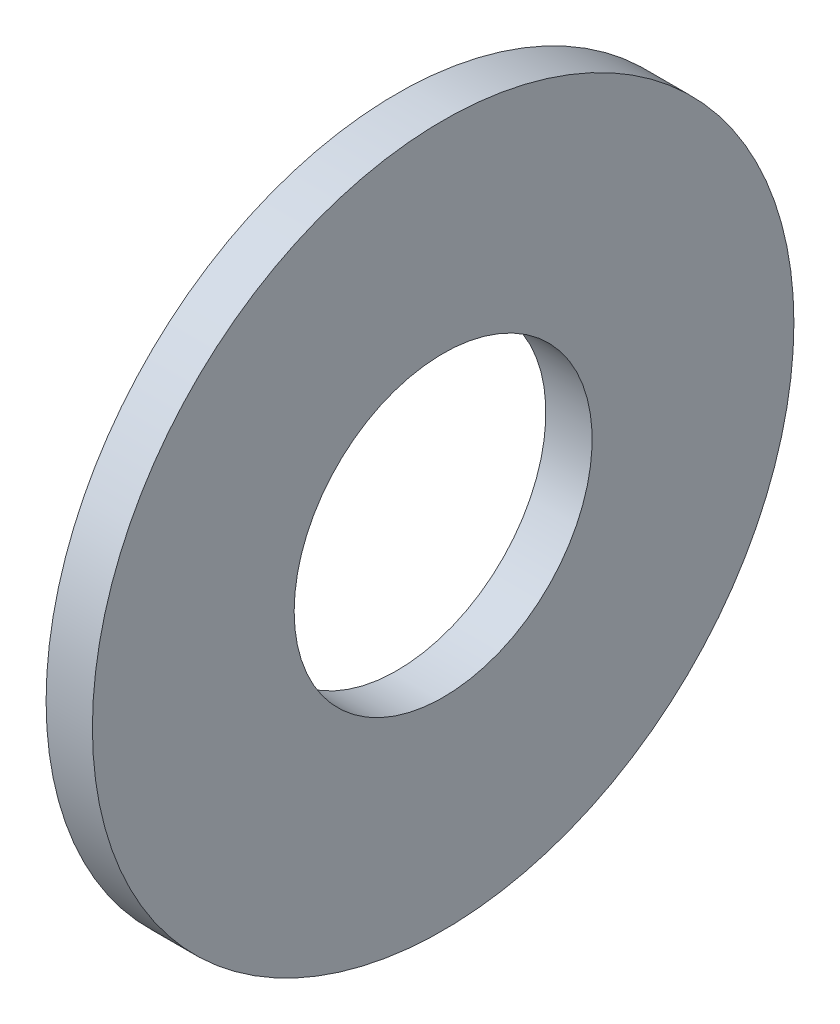
ISO-10303-21;
HEADER;
FILE_DESCRIPTION(('STEP AP214'),'2;1');
FILE_NAME('part.step','',(''),(''),'','','');
FILE_SCHEMA(('AUTOMOTIVE_DESIGN { 1 0 10303 214 1 1 1 1 }'));
ENDSEC;
DATA;
#1=APPLICATION_CONTEXT('core data for automotive mechanical design processes');
#2=APPLICATION_PROTOCOL_DEFINITION('international standard','automotive_design',2000,#1);
#3=PRODUCT_CONTEXT('',#1,'mechanical');
#4=PRODUCT('Part','Part','',(#3));
#5=PRODUCT_RELATED_PRODUCT_CATEGORY('part','',(#4));
#6=PRODUCT_DEFINITION_FORMATION('','',#4);
#7=PRODUCT_DEFINITION_CONTEXT('part definition',#1,'design');
#8=PRODUCT_DEFINITION('design','',#6,#7);
#9=PRODUCT_DEFINITION_SHAPE('','',#8);
#10=(LENGTH_UNIT() NAMED_UNIT(*) SI_UNIT(.MILLI.,.METRE.));
#11=(NAMED_UNIT(*) PLANE_ANGLE_UNIT() SI_UNIT($,.RADIAN.));
#12=(NAMED_UNIT(*) SI_UNIT($,.STERADIAN.) SOLID_ANGLE_UNIT());
#13=UNCERTAINTY_MEASURE_WITH_UNIT(LENGTH_MEASURE(1.E-05),#10,'distance_accuracy_value','');
#14=(GEOMETRIC_REPRESENTATION_CONTEXT(3) GLOBAL_UNCERTAINTY_ASSIGNED_CONTEXT((#13)) GLOBAL_UNIT_ASSIGNED_CONTEXT((#10,
#11,#12)) REPRESENTATION_CONTEXT('',''));
#15=CARTESIAN_POINT('',(0.,0.,0.));
#16=DIRECTION('',(0.,0.,1.));
#17=DIRECTION('',(1.,0.,0.));
#18=AXIS2_PLACEMENT_3D('',#15,#16,#17);
#19=CARTESIAN_POINT('',(-34.9249999999999,0.,0.));
#20=DIRECTION('',(-1.,0.,0.));
#21=DIRECTION('',(0.,0.,1.));
#22=AXIS2_PLACEMENT_3D('',#19,#20,#21);
#23=CYLINDRICAL_SURFACE('',#22,13.4874);
#24=CARTESIAN_POINT('',(0.,0.,0.));
#25=DIRECTION('',(-1.,0.,0.));
#26=DIRECTION('',(0.,0.,1.));
#27=AXIS2_PLACEMENT_3D('',#24,#25,#26);
#28=CIRCLE('',#27,13.4874);
#29=CARTESIAN_POINT('',(0.,0.,13.4874));
#30=VERTEX_POINT('',#29);
#31=EDGE_CURVE('E10',#30,#30,#28,.T.);
#32=ORIENTED_EDGE('',*,*,#31,.F.);
#33=EDGE_LOOP('',(#32));
#34=FACE_BOUND('',#33,.T.);
#35=CARTESIAN_POINT('',(-4.191,0.,0.));
#36=DIRECTION('',(-1.,0.,0.));
#37=DIRECTION('',(0.,0.,1.));
#38=AXIS2_PLACEMENT_3D('',#35,#36,#37);
#39=CIRCLE('',#38,13.4874);
#40=CARTESIAN_POINT('',(-4.191,0.,13.4874));
#41=VERTEX_POINT('',#40);
#42=EDGE_CURVE('E44',#41,#41,#39,.T.);
#43=ORIENTED_EDGE('',*,*,#42,.T.);
#44=EDGE_LOOP('',(#43));
#45=FACE_BOUND('',#44,.T.);
#46=ADVANCED_FACE('F30',(#34,#45),#23,.F.);
#47=CARTESIAN_POINT('',(0.,13.4874,0.));
#48=DIRECTION('',(-1.,0.,0.));
#49=DIRECTION('',(0.,0.,1.));
#50=AXIS2_PLACEMENT_3D('',#47,#48,#49);
#51=PLANE('',#50);
#52=CARTESIAN_POINT('',(0.,0.,0.));
#53=DIRECTION('',(-1.,0.,0.));
#54=DIRECTION('',(0.,0.,1.));
#55=AXIS2_PLACEMENT_3D('',#52,#53,#54);
#56=CIRCLE('',#55,31.75);
#57=CARTESIAN_POINT('',(0.,0.,31.75));
#58=VERTEX_POINT('',#57);
#59=EDGE_CURVE('E36',#58,#58,#56,.T.);
#60=ORIENTED_EDGE('',*,*,#59,.F.);
#61=EDGE_LOOP('',(#60));
#62=FACE_BOUND('',#61,.T.);
#63=ORIENTED_EDGE('',*,*,#31,.T.);
#64=EDGE_LOOP('',(#63));
#65=FACE_BOUND('',#64,.T.);
#66=ADVANCED_FACE('F59',(#62,#65),#51,.F.);
#67=CARTESIAN_POINT('',(-34.9249999999999,0.,0.));
#68=DIRECTION('',(-1.,0.,0.));
#69=DIRECTION('',(0.,0.,1.));
#70=AXIS2_PLACEMENT_3D('',#67,#68,#69);
#71=CYLINDRICAL_SURFACE('',#70,31.75);
#72=CARTESIAN_POINT('',(-4.191,0.,0.));
#73=DIRECTION('',(-1.,0.,0.));
#74=DIRECTION('',(0.,0.,1.));
#75=AXIS2_PLACEMENT_3D('',#72,#73,#74);
#76=CIRCLE('',#75,31.75);
#77=CARTESIAN_POINT('',(-4.191,0.,31.75));
#78=VERTEX_POINT('',#77);
#79=EDGE_CURVE('E40',#78,#78,#76,.T.);
#80=ORIENTED_EDGE('',*,*,#79,.F.);
#81=EDGE_LOOP('',(#80));
#82=FACE_BOUND('',#81,.T.);
#83=ORIENTED_EDGE('',*,*,#59,.T.);
#84=EDGE_LOOP('',(#83));
#85=FACE_BOUND('',#84,.T.);
#86=ADVANCED_FACE('F54',(#82,#85),#71,.T.);
#87=CARTESIAN_POINT('',(-4.191,31.75,0.));
#88=DIRECTION('',(1.,0.,0.));
#89=DIRECTION('',(0.,0.,-1.));
#90=AXIS2_PLACEMENT_3D('',#87,#88,#89);
#91=PLANE('',#90);
#92=ORIENTED_EDGE('',*,*,#42,.F.);
#93=EDGE_LOOP('',(#92));
#94=FACE_BOUND('',#93,.T.);
#95=ORIENTED_EDGE('',*,*,#79,.T.);
#96=EDGE_LOOP('',(#95));
#97=FACE_BOUND('',#96,.T.);
#98=ADVANCED_FACE('F51',(#94,#97),#91,.F.);
#99=CLOSED_SHELL('',(#46,#66,#86,#98));
#100=MANIFOLD_SOLID_BREP('B2',#99);
#101=ADVANCED_BREP_SHAPE_REPRESENTATION('',(#18,#100),#14);
#102=SHAPE_DEFINITION_REPRESENTATION(#9,#101);
ENDSEC;
END-ISO-10303-21;
